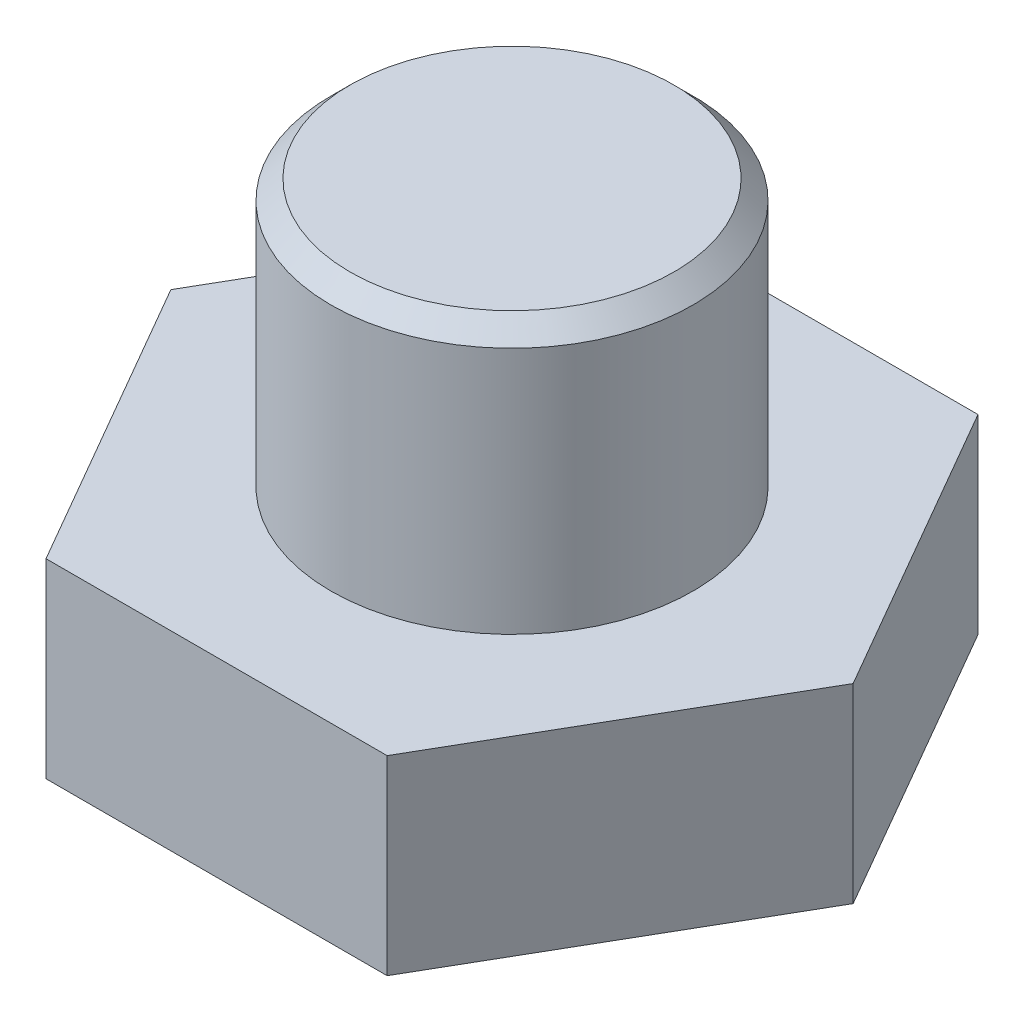
ISO-10303-21;
HEADER;
FILE_DESCRIPTION(('STEP AP214'),'2;1');
FILE_NAME('part.step','',(''),(''),'','','');
FILE_SCHEMA(('AUTOMOTIVE_DESIGN { 1 0 10303 214 1 1 1 1 }'));
ENDSEC;
DATA;
#1=APPLICATION_CONTEXT('core data for automotive mechanical design processes');
#2=APPLICATION_PROTOCOL_DEFINITION('international standard','automotive_design',2000,#1);
#3=PRODUCT_CONTEXT('',#1,'mechanical');
#4=PRODUCT('Part','Part','',(#3));
#5=PRODUCT_RELATED_PRODUCT_CATEGORY('part','',(#4));
#6=PRODUCT_DEFINITION_FORMATION('','',#4);
#7=PRODUCT_DEFINITION_CONTEXT('part definition',#1,'design');
#8=PRODUCT_DEFINITION('design','',#6,#7);
#9=PRODUCT_DEFINITION_SHAPE('','',#8);
#10=(LENGTH_UNIT() NAMED_UNIT(*) SI_UNIT(.MILLI.,.METRE.));
#11=(NAMED_UNIT(*) PLANE_ANGLE_UNIT() SI_UNIT($,.RADIAN.));
#12=(NAMED_UNIT(*) SI_UNIT($,.STERADIAN.) SOLID_ANGLE_UNIT());
#13=UNCERTAINTY_MEASURE_WITH_UNIT(LENGTH_MEASURE(1.E-05),#10,'distance_accuracy_value','');
#14=(GEOMETRIC_REPRESENTATION_CONTEXT(3) GLOBAL_UNCERTAINTY_ASSIGNED_CONTEXT((#13)) GLOBAL_UNIT_ASSIGNED_CONTEXT((#10,
#11,#12)) REPRESENTATION_CONTEXT('',''));
#15=CARTESIAN_POINT('',(0.,0.,0.));
#16=DIRECTION('',(0.,0.,1.));
#17=DIRECTION('',(1.,0.,0.));
#18=AXIS2_PLACEMENT_3D('',#15,#16,#17);
#19=CARTESIAN_POINT('',(-8.94892917243938,-10.,-15.4999999999999));
#20=DIRECTION('',(-0.866025403784442,0.,-0.499999999999995));
#21=DIRECTION('',(-0.499999999999995,0.,0.866025403784442));
#22=AXIS2_PLACEMENT_3D('',#19,#20,#21);
#23=PLANE('',#22);
#24=DIRECTION('',(-0.499999999999995,0.,0.866025403784442));
#25=VECTOR('',#24,1.);
#26=CARTESIAN_POINT('',(-8.94892917243938,0.,-15.4999999999999));
#27=LINE('',#26,#25);
#28=CARTESIAN_POINT('',(-8.94892917243938,0.,-15.4999999999999));
#29=VERTEX_POINT('',#28);
#30=CARTESIAN_POINT('',(-17.8978583448784,0.,0.));
#31=VERTEX_POINT('',#30);
#32=EDGE_CURVE('E120',#29,#31,#27,.T.);
#33=ORIENTED_EDGE('',*,*,#32,.F.);
#34=DIRECTION('',(0.,1.,0.));
#35=VECTOR('',#34,1.);
#36=CARTESIAN_POINT('',(-8.94892917243938,-10.,-15.4999999999999));
#37=LINE('',#36,#35);
#38=CARTESIAN_POINT('',(-8.94892917243938,-10.,-15.4999999999999));
#39=VERTEX_POINT('',#38);
#40=EDGE_CURVE('E49',#39,#29,#37,.T.);
#41=ORIENTED_EDGE('',*,*,#40,.F.);
#42=DIRECTION('',(-0.499999999999995,0.,0.866025403784442));
#43=VECTOR('',#42,1.);
#44=CARTESIAN_POINT('',(-8.94892917243938,-10.,-15.4999999999999));
#45=LINE('',#44,#43);
#46=CARTESIAN_POINT('',(-17.8978583448784,-10.,0.));
#47=VERTEX_POINT('',#46);
#48=EDGE_CURVE('E136',#39,#47,#45,.T.);
#49=ORIENTED_EDGE('',*,*,#48,.T.);
#50=DIRECTION('',(0.,1.,0.));
#51=VECTOR('',#50,1.);
#52=CARTESIAN_POINT('',(-17.8978583448784,-10.,0.));
#53=LINE('',#52,#51);
#54=EDGE_CURVE('E84',#47,#31,#53,.T.);
#55=ORIENTED_EDGE('',*,*,#54,.T.);
#56=EDGE_LOOP('',(#33,#41,#49,#55));
#57=FACE_BOUND('',#56,.T.);
#58=ADVANCED_FACE('F32',(#57),#23,.T.);
#59=CARTESIAN_POINT('',(8.94892917243905,-10.,-15.5000000000001));
#60=DIRECTION('',(0.,0.,-1.));
#61=DIRECTION('',(-1.,0.,0.));
#62=AXIS2_PLACEMENT_3D('',#59,#60,#61);
#63=PLANE('',#62);
#64=DIRECTION('',(-1.,0.,0.));
#65=VECTOR('',#64,1.);
#66=CARTESIAN_POINT('',(8.94892917243905,0.,-15.5000000000001));
#67=LINE('',#66,#65);
#68=CARTESIAN_POINT('',(8.94892917243905,0.,-15.5000000000001));
#69=VERTEX_POINT('',#68);
#70=EDGE_CURVE('E133',#69,#29,#67,.T.);
#71=ORIENTED_EDGE('',*,*,#70,.F.);
#72=DIRECTION('',(0.,1.,0.));
#73=VECTOR('',#72,1.);
#74=CARTESIAN_POINT('',(8.94892917243905,-10.,-15.5000000000001));
#75=LINE('',#74,#73);
#76=CARTESIAN_POINT('',(8.94892917243905,-10.,-15.5000000000001));
#77=VERTEX_POINT('',#76);
#78=EDGE_CURVE('E72',#77,#69,#75,.T.);
#79=ORIENTED_EDGE('',*,*,#78,.F.);
#80=DIRECTION('',(-1.,0.,0.));
#81=VECTOR('',#80,1.);
#82=CARTESIAN_POINT('',(8.94892917243905,-10.,-15.5000000000001));
#83=LINE('',#82,#81);
#84=EDGE_CURVE('E110',#77,#39,#83,.T.);
#85=ORIENTED_EDGE('',*,*,#84,.T.);
#86=ORIENTED_EDGE('',*,*,#40,.T.);
#87=EDGE_LOOP('',(#71,#79,#85,#86));
#88=FACE_BOUND('',#87,.T.);
#89=ADVANCED_FACE('F156',(#88),#63,.T.);
#90=CARTESIAN_POINT('',(17.8978583448784,-10.,-1.24980076832802E-13));
#91=DIRECTION('',(0.866025403784435,0.,-0.500000000000007));
#92=DIRECTION('',(-0.500000000000007,0.,-0.866025403784435));
#93=AXIS2_PLACEMENT_3D('',#90,#91,#92);
#94=PLANE('',#93);
#95=DIRECTION('',(-0.500000000000007,0.,-0.866025403784435));
#96=VECTOR('',#95,1.);
#97=CARTESIAN_POINT('',(17.8978583448784,0.,-1.24980076832802E-13));
#98=LINE('',#97,#96);
#99=CARTESIAN_POINT('',(17.8978583448784,0.,-1.24980076832802E-13));
#100=VERTEX_POINT('',#99);
#101=EDGE_CURVE('E97',#100,#69,#98,.T.);
#102=ORIENTED_EDGE('',*,*,#101,.F.);
#103=DIRECTION('',(0.,1.,0.));
#104=VECTOR('',#103,1.);
#105=CARTESIAN_POINT('',(17.8978583448784,-10.,-1.24980076832802E-13));
#106=LINE('',#105,#104);
#107=CARTESIAN_POINT('',(17.8978583448784,-10.,-1.24980076832802E-13));
#108=VERTEX_POINT('',#107);
#109=EDGE_CURVE('E92',#108,#100,#106,.T.);
#110=ORIENTED_EDGE('',*,*,#109,.F.);
#111=DIRECTION('',(-0.500000000000007,0.,-0.866025403784435));
#112=VECTOR('',#111,1.);
#113=CARTESIAN_POINT('',(17.8978583448784,-10.,-1.24980076832802E-13));
#114=LINE('',#113,#112);
#115=EDGE_CURVE('E95',#108,#77,#114,.T.);
#116=ORIENTED_EDGE('',*,*,#115,.T.);
#117=ORIENTED_EDGE('',*,*,#78,.T.);
#118=EDGE_LOOP('',(#102,#110,#116,#117));
#119=FACE_BOUND('',#118,.T.);
#120=ADVANCED_FACE('F94',(#119),#94,.T.);
#121=CARTESIAN_POINT('',(8.94892917243927,-10.,15.5));
#122=DIRECTION('',(0.866025403784442,0.,0.499999999999995));
#123=DIRECTION('',(0.499999999999995,0.,-0.866025403784442));
#124=AXIS2_PLACEMENT_3D('',#121,#122,#123);
#125=PLANE('',#124);
#126=DIRECTION('',(0.499999999999995,0.,-0.866025403784441));
#127=VECTOR('',#126,1.);
#128=CARTESIAN_POINT('',(8.94892917243927,0.,15.5));
#129=LINE('',#128,#127);
#130=CARTESIAN_POINT('',(8.94892917243927,0.,15.5));
#131=VERTEX_POINT('',#130);
#132=EDGE_CURVE('E130',#131,#100,#129,.T.);
#133=ORIENTED_EDGE('',*,*,#132,.F.);
#134=DIRECTION('',(0.,1.,0.));
#135=VECTOR('',#134,1.);
#136=CARTESIAN_POINT('',(8.94892917243927,-10.,15.5));
#137=LINE('',#136,#135);
#138=CARTESIAN_POINT('',(8.94892917243927,-10.,15.5));
#139=VERTEX_POINT('',#138);
#140=EDGE_CURVE('E102',#139,#131,#137,.T.);
#141=ORIENTED_EDGE('',*,*,#140,.F.);
#142=DIRECTION('',(0.499999999999995,0.,-0.866025403784441));
#143=VECTOR('',#142,1.);
#144=CARTESIAN_POINT('',(8.94892917243927,-10.,15.5));
#145=LINE('',#144,#143);
#146=EDGE_CURVE('E108',#139,#108,#145,.T.);
#147=ORIENTED_EDGE('',*,*,#146,.T.);
#148=ORIENTED_EDGE('',*,*,#109,.T.);
#149=EDGE_LOOP('',(#133,#141,#147,#148));
#150=FACE_BOUND('',#149,.T.);
#151=ADVANCED_FACE('F112',(#150),#125,.T.);
#152=CARTESIAN_POINT('',(-8.94892917243916,-10.,15.5));
#153=DIRECTION('',(0.,0.,1.));
#154=DIRECTION('',(1.,0.,0.));
#155=AXIS2_PLACEMENT_3D('',#152,#153,#154);
#156=PLANE('',#155);
#157=DIRECTION('',(1.,0.,0.));
#158=VECTOR('',#157,1.);
#159=CARTESIAN_POINT('',(-8.94892917243916,0.,15.5));
#160=LINE('',#159,#158);
#161=CARTESIAN_POINT('',(-8.94892917243916,0.,15.5));
#162=VERTEX_POINT('',#161);
#163=EDGE_CURVE('E127',#162,#131,#160,.T.);
#164=ORIENTED_EDGE('',*,*,#163,.F.);
#165=DIRECTION('',(0.,1.,0.));
#166=VECTOR('',#165,1.);
#167=CARTESIAN_POINT('',(-8.94892917243916,-10.,15.5));
#168=LINE('',#167,#166);
#169=CARTESIAN_POINT('',(-8.94892917243916,-10.,15.5));
#170=VERTEX_POINT('',#169);
#171=EDGE_CURVE('E140',#170,#162,#168,.T.);
#172=ORIENTED_EDGE('',*,*,#171,.F.);
#173=DIRECTION('',(1.,0.,0.));
#174=VECTOR('',#173,1.);
#175=CARTESIAN_POINT('',(-8.94892917243916,-10.,15.5));
#176=LINE('',#175,#174);
#177=EDGE_CURVE('E113',#170,#139,#176,.T.);
#178=ORIENTED_EDGE('',*,*,#177,.T.);
#179=ORIENTED_EDGE('',*,*,#140,.T.);
#180=EDGE_LOOP('',(#164,#172,#178,#179));
#181=FACE_BOUND('',#180,.T.);
#182=ADVANCED_FACE('F165',(#181),#156,.T.);
#183=CARTESIAN_POINT('',(-17.8978583448784,-10.,0.));
#184=DIRECTION('',(-0.866025403784438,0.,0.500000000000001));
#185=DIRECTION('',(0.500000000000001,0.,0.866025403784438));
#186=AXIS2_PLACEMENT_3D('',#183,#184,#185);
#187=PLANE('',#186);
#188=DIRECTION('',(0.500000000000001,0.,0.866025403784438));
#189=VECTOR('',#188,1.);
#190=CARTESIAN_POINT('',(-17.8978583448784,0.,0.));
#191=LINE('',#190,#189);
#192=EDGE_CURVE('E123',#31,#162,#191,.T.);
#193=ORIENTED_EDGE('',*,*,#192,.F.);
#194=ORIENTED_EDGE('',*,*,#54,.F.);
#195=DIRECTION('',(0.500000000000001,0.,0.866025403784438));
#196=VECTOR('',#195,1.);
#197=CARTESIAN_POINT('',(-17.8978583448784,-10.,0.));
#198=LINE('',#197,#196);
#199=EDGE_CURVE('E115',#47,#170,#198,.T.);
#200=ORIENTED_EDGE('',*,*,#199,.T.);
#201=ORIENTED_EDGE('',*,*,#171,.T.);
#202=EDGE_LOOP('',(#193,#194,#200,#201));
#203=FACE_BOUND('',#202,.T.);
#204=ADVANCED_FACE('F162',(#203),#187,.T.);
#205=CARTESIAN_POINT('',(0.,-10.,0.));
#206=DIRECTION('',(0.,1.,0.));
#207=DIRECTION('',(0.,0.,1.));
#208=AXIS2_PLACEMENT_3D('',#205,#206,#207);
#209=PLANE('',#208);
#210=ORIENTED_EDGE('',*,*,#48,.F.);
#211=ORIENTED_EDGE('',*,*,#84,.F.);
#212=ORIENTED_EDGE('',*,*,#115,.F.);
#213=ORIENTED_EDGE('',*,*,#146,.F.);
#214=ORIENTED_EDGE('',*,*,#177,.F.);
#215=ORIENTED_EDGE('',*,*,#199,.F.);
#216=EDGE_LOOP('',(#210,#211,#212,#213,#214,#215));
#217=FACE_BOUND('',#216,.T.);
#218=ADVANCED_FACE('F106',(#217),#209,.F.);
#219=CARTESIAN_POINT('',(0.,0.,0.));
#220=DIRECTION('',(0.,1.,0.));
#221=DIRECTION('',(0.,0.,1.));
#222=AXIS2_PLACEMENT_3D('',#219,#220,#221);
#223=PLANE('',#222);
#224=CARTESIAN_POINT('',(0.,0.,0.));
#225=DIRECTION('',(0.,1.,0.));
#226=DIRECTION('',(0.,0.,1.));
#227=AXIS2_PLACEMENT_3D('',#224,#225,#226);
#228=CIRCLE('',#227,9.5);
#229=CARTESIAN_POINT('',(0.,0.,9.5));
#230=VERTEX_POINT('',#229);
#231=EDGE_CURVE('E124',#230,#230,#228,.T.);
#232=ORIENTED_EDGE('',*,*,#231,.F.);
#233=EDGE_LOOP('',(#232));
#234=FACE_BOUND('',#233,.T.);
#235=ORIENTED_EDGE('',*,*,#32,.T.);
#236=ORIENTED_EDGE('',*,*,#192,.T.);
#237=ORIENTED_EDGE('',*,*,#163,.T.);
#238=ORIENTED_EDGE('',*,*,#132,.T.);
#239=ORIENTED_EDGE('',*,*,#101,.T.);
#240=ORIENTED_EDGE('',*,*,#70,.T.);
#241=EDGE_LOOP('',(#235,#236,#237,#238,#239,#240));
#242=FACE_BOUND('',#241,.T.);
#243=ADVANCED_FACE('F173',(#234,#242),#223,.T.);
#244=CARTESIAN_POINT('',(0.,14.,0.));
#245=DIRECTION('',(0.,-1.,0.));
#246=DIRECTION('',(0.,0.,-1.));
#247=AXIS2_PLACEMENT_3D('',#244,#245,#246);
#248=CYLINDRICAL_SURFACE('',#247,9.5);
#249=CARTESIAN_POINT('',(0.,13.,0.));
#250=DIRECTION('',(0.,1.,0.));
#251=DIRECTION('',(0.,0.,1.));
#252=AXIS2_PLACEMENT_3D('',#249,#250,#251);
#253=CIRCLE('',#252,9.5);
#254=CARTESIAN_POINT('',(0.,13.,9.5));
#255=VERTEX_POINT('',#254);
#256=EDGE_CURVE('E11',#255,#255,#253,.F.);
#257=ORIENTED_EDGE('',*,*,#256,.T.);
#258=EDGE_LOOP('',(#257));
#259=FACE_BOUND('',#258,.T.);
#260=ORIENTED_EDGE('',*,*,#231,.T.);
#261=EDGE_LOOP('',(#260));
#262=FACE_BOUND('',#261,.T.);
#263=ADVANCED_FACE('F152',(#259,#262),#248,.T.);
#264=CARTESIAN_POINT('',(0.,14.,0.));
#265=DIRECTION('',(0.,1.,0.));
#266=DIRECTION('',(0.,0.,1.));
#267=AXIS2_PLACEMENT_3D('',#264,#265,#266);
#268=PLANE('',#267);
#269=CARTESIAN_POINT('',(0.,14.,0.));
#270=DIRECTION('',(0.,1.,0.));
#271=DIRECTION('',(0.,0.,1.));
#272=AXIS2_PLACEMENT_3D('',#269,#270,#271);
#273=CIRCLE('',#272,8.5);
#274=CARTESIAN_POINT('',(0.,14.,8.5));
#275=VERTEX_POINT('',#274);
#276=EDGE_CURVE('E41',#275,#275,#273,.T.);
#277=ORIENTED_EDGE('',*,*,#276,.T.);
#278=EDGE_LOOP('',(#277));
#279=FACE_BOUND('',#278,.T.);
#280=ADVANCED_FACE('F145',(#279),#268,.T.);
#281=CARTESIAN_POINT('',(0.,14.,0.));
#282=DIRECTION('',(0.,-1.,0.));
#283=DIRECTION('',(0.,0.,-1.));
#284=AXIS2_PLACEMENT_3D('',#281,#282,#283);
#285=CONICAL_SURFACE('',#284,8.5,0.785398163397449);
#286=ORIENTED_EDGE('',*,*,#256,.F.);
#287=EDGE_LOOP('',(#286));
#288=FACE_BOUND('',#287,.T.);
#289=ORIENTED_EDGE('',*,*,#276,.F.);
#290=EDGE_LOOP('',(#289));
#291=FACE_BOUND('',#290,.T.);
#292=ADVANCED_FACE('F34',(#288,#291),#285,.T.);
#293=CLOSED_SHELL('',(#58,#89,#120,#151,#182,#204,#218,#243,#263,#280,#292));
#294=MANIFOLD_SOLID_BREP('B2',#293);
#295=ADVANCED_BREP_SHAPE_REPRESENTATION('',(#18,#294),#14);
#296=SHAPE_DEFINITION_REPRESENTATION(#9,#295);
ENDSEC;
END-ISO-10303-21;
